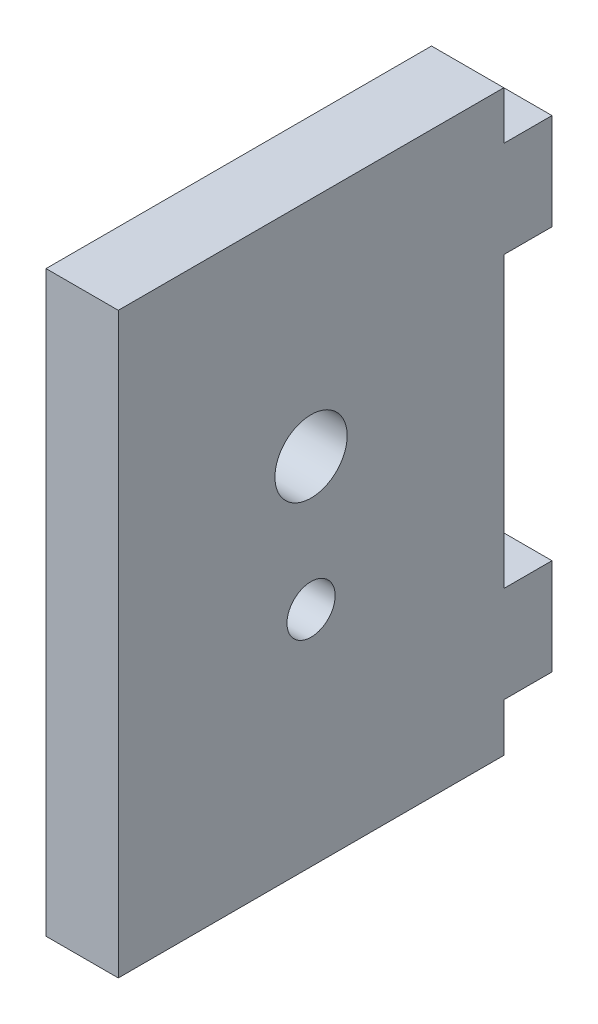
ISO-10303-21;
HEADER;
FILE_DESCRIPTION(('STEP AP214'),'2;1');
FILE_NAME('part.step','',(''),(''),'','','');
FILE_SCHEMA(('AUTOMOTIVE_DESIGN { 1 0 10303 214 1 1 1 1 }'));
ENDSEC;
DATA;
#1=APPLICATION_CONTEXT('core data for automotive mechanical design processes');
#2=APPLICATION_PROTOCOL_DEFINITION('international standard','automotive_design',2000,#1);
#3=PRODUCT_CONTEXT('',#1,'mechanical');
#4=PRODUCT('Part','Part','',(#3));
#5=PRODUCT_RELATED_PRODUCT_CATEGORY('part','',(#4));
#6=PRODUCT_DEFINITION_FORMATION('','',#4);
#7=PRODUCT_DEFINITION_CONTEXT('part definition',#1,'design');
#8=PRODUCT_DEFINITION('design','',#6,#7);
#9=PRODUCT_DEFINITION_SHAPE('','',#8);
#10=(LENGTH_UNIT() NAMED_UNIT(*) SI_UNIT(.MILLI.,.METRE.));
#11=(NAMED_UNIT(*) PLANE_ANGLE_UNIT() SI_UNIT($,.RADIAN.));
#12=(NAMED_UNIT(*) SI_UNIT($,.STERADIAN.) SOLID_ANGLE_UNIT());
#13=UNCERTAINTY_MEASURE_WITH_UNIT(LENGTH_MEASURE(1.E-05),#10,'distance_accuracy_value','');
#14=(GEOMETRIC_REPRESENTATION_CONTEXT(3) GLOBAL_UNCERTAINTY_ASSIGNED_CONTEXT((#13)) GLOBAL_UNIT_ASSIGNED_CONTEXT((#10,
#11,#12)) REPRESENTATION_CONTEXT('',''));
#15=CARTESIAN_POINT('',(0.,0.,0.));
#16=DIRECTION('',(0.,0.,1.));
#17=DIRECTION('',(1.,0.,0.));
#18=AXIS2_PLACEMENT_3D('',#15,#16,#17);
#19=CARTESIAN_POINT('',(9.525,0.,0.));
#20=DIRECTION('',(0.,0.,1.));
#21=DIRECTION('',(1.,0.,0.));
#22=AXIS2_PLACEMENT_3D('',#19,#20,#21);
#23=PLANE('',#22);
#24=DIRECTION('',(1.,0.,0.));
#25=VECTOR('',#24,1.);
#26=CARTESIAN_POINT('',(9.525,19.05,0.));
#27=LINE('',#26,#25);
#28=CARTESIAN_POINT('',(0.,19.05,0.));
#29=VERTEX_POINT('',#28);
#30=CARTESIAN_POINT('',(9.525,19.05,0.));
#31=VERTEX_POINT('',#30);
#32=EDGE_CURVE('E344',#29,#31,#27,.T.);
#33=ORIENTED_EDGE('',*,*,#32,.F.);
#34=DIRECTION('',(0.,1.,0.));
#35=VECTOR('',#34,1.);
#36=CARTESIAN_POINT('',(0.,0.,0.));
#37=LINE('',#36,#35);
#38=CARTESIAN_POINT('',(0.,57.15,0.));
#39=VERTEX_POINT('',#38);
#40=EDGE_CURVE('E429',#29,#39,#37,.T.);
#41=ORIENTED_EDGE('',*,*,#40,.T.);
#42=DIRECTION('',(-1.,0.,0.));
#43=VECTOR('',#42,1.);
#44=CARTESIAN_POINT('',(9.525,57.15,0.));
#45=LINE('',#44,#43);
#46=CARTESIAN_POINT('',(9.525,57.15,0.));
#47=VERTEX_POINT('',#46);
#48=EDGE_CURVE('E255',#47,#39,#45,.T.);
#49=ORIENTED_EDGE('',*,*,#48,.F.);
#50=DIRECTION('',(0.,1.,0.));
#51=VECTOR('',#50,1.);
#52=CARTESIAN_POINT('',(9.525,0.,0.));
#53=LINE('',#52,#51);
#54=EDGE_CURVE('E413',#31,#47,#53,.T.);
#55=ORIENTED_EDGE('',*,*,#54,.F.);
#56=EDGE_LOOP('',(#33,#41,#49,#55));
#57=FACE_BOUND('',#56,.T.);
#58=ADVANCED_FACE('F227',(#57),#23,.F.);
#59=DIRECTION('',(-1.,0.,0.));
#60=VECTOR('',#59,1.);
#61=CARTESIAN_POINT('',(9.525,6.35,0.));
#62=LINE('',#61,#60);
#63=CARTESIAN_POINT('',(9.525,6.35,0.));
#64=VERTEX_POINT('',#63);
#65=CARTESIAN_POINT('',(0.,6.35,0.));
#66=VERTEX_POINT('',#65);
#67=EDGE_CURVE('E383',#64,#66,#62,.T.);
#68=ORIENTED_EDGE('',*,*,#67,.F.);
#69=CARTESIAN_POINT('',(9.525,0.,0.));
#70=VERTEX_POINT('',#69);
#71=EDGE_CURVE('E350',#70,#64,#53,.T.);
#72=ORIENTED_EDGE('',*,*,#71,.F.);
#73=DIRECTION('',(-1.,0.,0.));
#74=VECTOR('',#73,1.);
#75=CARTESIAN_POINT('',(9.525,0.,0.));
#76=LINE('',#75,#74);
#77=CARTESIAN_POINT('',(0.,0.,0.));
#78=VERTEX_POINT('',#77);
#79=EDGE_CURVE('E12',#70,#78,#76,.T.);
#80=ORIENTED_EDGE('',*,*,#79,.T.);
#81=EDGE_CURVE('E426',#78,#66,#37,.T.);
#82=ORIENTED_EDGE('',*,*,#81,.T.);
#83=EDGE_LOOP('',(#68,#72,#80,#82));
#84=FACE_BOUND('',#83,.T.);
#85=ADVANCED_FACE('F504',(#84),#23,.F.);
#86=DIRECTION('',(1.,0.,0.));
#87=VECTOR('',#86,1.);
#88=CARTESIAN_POINT('',(9.525,69.85,0.));
#89=LINE('',#88,#87);
#90=CARTESIAN_POINT('',(0.,69.85,0.));
#91=VERTEX_POINT('',#90);
#92=CARTESIAN_POINT('',(9.525,69.85,0.));
#93=VERTEX_POINT('',#92);
#94=EDGE_CURVE('E378',#91,#93,#89,.T.);
#95=ORIENTED_EDGE('',*,*,#94,.F.);
#96=CARTESIAN_POINT('',(0.,76.2,0.));
#97=VERTEX_POINT('',#96);
#98=EDGE_CURVE('E422',#91,#97,#37,.T.);
#99=ORIENTED_EDGE('',*,*,#98,.T.);
#100=DIRECTION('',(-1.,0.,0.));
#101=VECTOR('',#100,1.);
#102=CARTESIAN_POINT('',(9.525,76.2,0.));
#103=LINE('',#102,#101);
#104=CARTESIAN_POINT('',(9.525,76.2,0.));
#105=VERTEX_POINT('',#104);
#106=EDGE_CURVE('E239',#105,#97,#103,.T.);
#107=ORIENTED_EDGE('',*,*,#106,.F.);
#108=EDGE_CURVE('E247',#93,#105,#53,.T.);
#109=ORIENTED_EDGE('',*,*,#108,.F.);
#110=EDGE_LOOP('',(#95,#99,#107,#109));
#111=FACE_BOUND('',#110,.T.);
#112=ADVANCED_FACE('F477',(#111),#23,.F.);
#113=CARTESIAN_POINT('',(9.525,0.,0.));
#114=DIRECTION('',(0.,1.,0.));
#115=DIRECTION('',(0.,0.,1.));
#116=AXIS2_PLACEMENT_3D('',#113,#114,#115);
#117=PLANE('',#116);
#118=DIRECTION('',(0.,0.,-1.));
#119=VECTOR('',#118,1.);
#120=CARTESIAN_POINT('',(0.,0.,0.));
#121=LINE('',#120,#119);
#122=CARTESIAN_POINT('',(0.,0.,50.8));
#123=VERTEX_POINT('',#122);
#124=EDGE_CURVE('E398',#123,#78,#121,.T.);
#125=ORIENTED_EDGE('',*,*,#124,.T.);
#126=ORIENTED_EDGE('',*,*,#79,.F.);
#127=DIRECTION('',(0.,0.,-1.));
#128=VECTOR('',#127,1.);
#129=CARTESIAN_POINT('',(9.525,0.,0.));
#130=LINE('',#129,#128);
#131=CARTESIAN_POINT('',(9.525,0.,50.8));
#132=VERTEX_POINT('',#131);
#133=EDGE_CURVE('E406',#132,#70,#130,.T.);
#134=ORIENTED_EDGE('',*,*,#133,.F.);
#135=DIRECTION('',(-1.,0.,0.));
#136=VECTOR('',#135,1.);
#137=CARTESIAN_POINT('',(9.525,0.,50.8));
#138=LINE('',#137,#136);
#139=EDGE_CURVE('E423',#132,#123,#138,.T.);
#140=ORIENTED_EDGE('',*,*,#139,.T.);
#141=EDGE_LOOP('',(#125,#126,#134,#140));
#142=FACE_BOUND('',#141,.T.);
#143=ADVANCED_FACE('F234',(#142),#117,.F.);
#144=CARTESIAN_POINT('',(9.525,76.2,0.));
#145=DIRECTION('',(0.,-1.,0.));
#146=DIRECTION('',(0.,0.,-1.));
#147=AXIS2_PLACEMENT_3D('',#144,#145,#146);
#148=PLANE('',#147);
#149=DIRECTION('',(0.,0.,1.));
#150=VECTOR('',#149,1.);
#151=CARTESIAN_POINT('',(0.,76.2,0.));
#152=LINE('',#151,#150);
#153=CARTESIAN_POINT('',(0.,76.2,50.8));
#154=VERTEX_POINT('',#153);
#155=EDGE_CURVE('E427',#97,#154,#152,.T.);
#156=ORIENTED_EDGE('',*,*,#155,.T.);
#157=DIRECTION('',(-1.,0.,0.));
#158=VECTOR('',#157,1.);
#159=CARTESIAN_POINT('',(9.525,76.2,50.8));
#160=LINE('',#159,#158);
#161=CARTESIAN_POINT('',(9.525,76.2,50.8));
#162=VERTEX_POINT('',#161);
#163=EDGE_CURVE('E437',#162,#154,#160,.T.);
#164=ORIENTED_EDGE('',*,*,#163,.F.);
#165=DIRECTION('',(0.,0.,1.));
#166=VECTOR('',#165,1.);
#167=CARTESIAN_POINT('',(9.525,76.2,0.));
#168=LINE('',#167,#166);
#169=EDGE_CURVE('E411',#105,#162,#168,.T.);
#170=ORIENTED_EDGE('',*,*,#169,.F.);
#171=ORIENTED_EDGE('',*,*,#106,.T.);
#172=EDGE_LOOP('',(#156,#164,#170,#171));
#173=FACE_BOUND('',#172,.T.);
#174=ADVANCED_FACE('F450',(#173),#148,.F.);
#175=CARTESIAN_POINT('',(9.525,0.,50.8));
#176=DIRECTION('',(0.,0.,-1.));
#177=DIRECTION('',(-1.,0.,0.));
#178=AXIS2_PLACEMENT_3D('',#175,#176,#177);
#179=PLANE('',#178);
#180=DIRECTION('',(0.,-1.,0.));
#181=VECTOR('',#180,1.);
#182=CARTESIAN_POINT('',(0.,0.,50.8));
#183=LINE('',#182,#181);
#184=EDGE_CURVE('E412',#154,#123,#183,.T.);
#185=ORIENTED_EDGE('',*,*,#184,.T.);
#186=ORIENTED_EDGE('',*,*,#139,.F.);
#187=DIRECTION('',(0.,-1.,0.));
#188=VECTOR('',#187,1.);
#189=CARTESIAN_POINT('',(9.525,0.,50.8));
#190=LINE('',#189,#188);
#191=EDGE_CURVE('E416',#162,#132,#190,.T.);
#192=ORIENTED_EDGE('',*,*,#191,.F.);
#193=ORIENTED_EDGE('',*,*,#163,.T.);
#194=EDGE_LOOP('',(#185,#186,#192,#193));
#195=FACE_BOUND('',#194,.T.);
#196=ADVANCED_FACE('F460',(#195),#179,.F.);
#197=CARTESIAN_POINT('',(9.525,0.,0.));
#198=DIRECTION('',(-1.,0.,0.));
#199=DIRECTION('',(0.,0.,1.));
#200=AXIS2_PLACEMENT_3D('',#197,#198,#199);
#201=PLANE('',#200);
#202=CARTESIAN_POINT('',(9.525,29.36875,25.4));
#203=DIRECTION('',(1.,0.,0.));
#204=DIRECTION('',(0.,0.,-1.));
#205=AXIS2_PLACEMENT_3D('',#202,#203,#204);
#206=CIRCLE('',#205,3.175);
#207=CARTESIAN_POINT('',(9.525,29.36875,22.225));
#208=VERTEX_POINT('',#207);
#209=EDGE_CURVE('E402',#208,#208,#206,.T.);
#210=ORIENTED_EDGE('',*,*,#209,.F.);
#211=EDGE_LOOP('',(#210));
#212=FACE_BOUND('',#211,.T.);
#213=CARTESIAN_POINT('',(9.525,46.83125,25.4));
#214=DIRECTION('',(1.,0.,0.));
#215=DIRECTION('',(0.,0.,-1.));
#216=AXIS2_PLACEMENT_3D('',#213,#214,#215);
#217=CIRCLE('',#216,4.7625);
#218=CARTESIAN_POINT('',(9.525,46.83125,20.6375));
#219=VERTEX_POINT('',#218);
#220=EDGE_CURVE('E352',#219,#219,#217,.T.);
#221=ORIENTED_EDGE('',*,*,#220,.F.);
#222=EDGE_LOOP('',(#221));
#223=FACE_BOUND('',#222,.T.);
#224=ORIENTED_EDGE('',*,*,#133,.T.);
#225=ORIENTED_EDGE('',*,*,#71,.T.);
#226=DIRECTION('',(0.,0.,1.));
#227=VECTOR('',#226,1.);
#228=CARTESIAN_POINT('',(9.525,6.35,-6.35));
#229=LINE('',#228,#227);
#230=CARTESIAN_POINT('',(9.525,6.35,-6.35));
#231=VERTEX_POINT('',#230);
#232=EDGE_CURVE('E324',#231,#64,#229,.T.);
#233=ORIENTED_EDGE('',*,*,#232,.F.);
#234=DIRECTION('',(0.,-1.,0.));
#235=VECTOR('',#234,1.);
#236=CARTESIAN_POINT('',(9.525,6.35,-6.35));
#237=LINE('',#236,#235);
#238=CARTESIAN_POINT('',(9.525,19.05,-6.35));
#239=VERTEX_POINT('',#238);
#240=EDGE_CURVE('E335',#239,#231,#237,.T.);
#241=ORIENTED_EDGE('',*,*,#240,.F.);
#242=DIRECTION('',(0.,0.,1.));
#243=VECTOR('',#242,1.);
#244=CARTESIAN_POINT('',(9.525,19.05,-6.35));
#245=LINE('',#244,#243);
#246=EDGE_CURVE('E466',#239,#31,#245,.T.);
#247=ORIENTED_EDGE('',*,*,#246,.T.);
#248=ORIENTED_EDGE('',*,*,#54,.T.);
#249=DIRECTION('',(0.,0.,1.));
#250=VECTOR('',#249,1.);
#251=CARTESIAN_POINT('',(9.525,57.15,-6.35));
#252=LINE('',#251,#250);
#253=CARTESIAN_POINT('',(9.525,57.15,-6.35));
#254=VERTEX_POINT('',#253);
#255=EDGE_CURVE('E363',#254,#47,#252,.T.);
#256=ORIENTED_EDGE('',*,*,#255,.F.);
#257=DIRECTION('',(0.,-1.,0.));
#258=VECTOR('',#257,1.);
#259=CARTESIAN_POINT('',(9.525,57.15,-6.35));
#260=LINE('',#259,#258);
#261=CARTESIAN_POINT('',(9.525,69.85,-6.35));
#262=VERTEX_POINT('',#261);
#263=EDGE_CURVE('E381',#262,#254,#260,.T.);
#264=ORIENTED_EDGE('',*,*,#263,.F.);
#265=DIRECTION('',(0.,0.,1.));
#266=VECTOR('',#265,1.);
#267=CARTESIAN_POINT('',(9.525,69.85,-6.35));
#268=LINE('',#267,#266);
#269=EDGE_CURVE('E373',#262,#93,#268,.T.);
#270=ORIENTED_EDGE('',*,*,#269,.T.);
#271=ORIENTED_EDGE('',*,*,#108,.T.);
#272=ORIENTED_EDGE('',*,*,#169,.T.);
#273=ORIENTED_EDGE('',*,*,#191,.T.);
#274=EDGE_LOOP('',(#224,#225,#233,#241,#247,#248,#256,#264,#270,#271,#272,#273));
#275=FACE_BOUND('',#274,.T.);
#276=ADVANCED_FACE('F347',(#212,#223,#275),#201,.F.);
#277=CARTESIAN_POINT('',(0.,0.,0.));
#278=DIRECTION('',(-1.,0.,0.));
#279=DIRECTION('',(0.,0.,1.));
#280=AXIS2_PLACEMENT_3D('',#277,#278,#279);
#281=PLANE('',#280);
#282=CARTESIAN_POINT('',(0.,29.36875,25.4));
#283=DIRECTION('',(1.,0.,0.));
#284=DIRECTION('',(0.,0.,-1.));
#285=AXIS2_PLACEMENT_3D('',#282,#283,#284);
#286=CIRCLE('',#285,3.175);
#287=CARTESIAN_POINT('',(0.,29.36875,22.225));
#288=VERTEX_POINT('',#287);
#289=EDGE_CURVE('E397',#288,#288,#286,.T.);
#290=ORIENTED_EDGE('',*,*,#289,.T.);
#291=EDGE_LOOP('',(#290));
#292=FACE_BOUND('',#291,.T.);
#293=CARTESIAN_POINT('',(0.,46.83125,25.4));
#294=DIRECTION('',(1.,0.,0.));
#295=DIRECTION('',(0.,0.,-1.));
#296=AXIS2_PLACEMENT_3D('',#293,#294,#295);
#297=CIRCLE('',#296,4.7625);
#298=CARTESIAN_POINT('',(0.,46.83125,20.6375));
#299=VERTEX_POINT('',#298);
#300=EDGE_CURVE('E349',#299,#299,#297,.T.);
#301=ORIENTED_EDGE('',*,*,#300,.T.);
#302=EDGE_LOOP('',(#301));
#303=FACE_BOUND('',#302,.T.);
#304=ORIENTED_EDGE('',*,*,#124,.F.);
#305=ORIENTED_EDGE('',*,*,#184,.F.);
#306=ORIENTED_EDGE('',*,*,#155,.F.);
#307=ORIENTED_EDGE('',*,*,#98,.F.);
#308=DIRECTION('',(0.,0.,1.));
#309=VECTOR('',#308,1.);
#310=CARTESIAN_POINT('',(0.,69.85,-6.35));
#311=LINE('',#310,#309);
#312=CARTESIAN_POINT('',(0.,69.85,-6.35));
#313=VERTEX_POINT('',#312);
#314=EDGE_CURVE('E369',#313,#91,#311,.T.);
#315=ORIENTED_EDGE('',*,*,#314,.F.);
#316=DIRECTION('',(0.,1.,0.));
#317=VECTOR('',#316,1.);
#318=CARTESIAN_POINT('',(0.,57.15,-6.35));
#319=LINE('',#318,#317);
#320=CARTESIAN_POINT('',(0.,57.15,-6.35));
#321=VERTEX_POINT('',#320);
#322=EDGE_CURVE('E390',#321,#313,#319,.T.);
#323=ORIENTED_EDGE('',*,*,#322,.F.);
#324=DIRECTION('',(0.,0.,1.));
#325=VECTOR('',#324,1.);
#326=CARTESIAN_POINT('',(0.,57.15,-6.35));
#327=LINE('',#326,#325);
#328=EDGE_CURVE('E364',#321,#39,#327,.T.);
#329=ORIENTED_EDGE('',*,*,#328,.T.);
#330=ORIENTED_EDGE('',*,*,#40,.F.);
#331=DIRECTION('',(0.,0.,1.));
#332=VECTOR('',#331,1.);
#333=CARTESIAN_POINT('',(0.,19.05,-6.35));
#334=LINE('',#333,#332);
#335=CARTESIAN_POINT('',(0.,19.05,-6.35));
#336=VERTEX_POINT('',#335);
#337=EDGE_CURVE('E359',#336,#29,#334,.T.);
#338=ORIENTED_EDGE('',*,*,#337,.F.);
#339=DIRECTION('',(0.,1.,0.));
#340=VECTOR('',#339,1.);
#341=CARTESIAN_POINT('',(0.,6.35,-6.35));
#342=LINE('',#341,#340);
#343=CARTESIAN_POINT('',(0.,6.35,-6.35));
#344=VERTEX_POINT('',#343);
#345=EDGE_CURVE('E332',#344,#336,#342,.T.);
#346=ORIENTED_EDGE('',*,*,#345,.F.);
#347=DIRECTION('',(0.,0.,1.));
#348=VECTOR('',#347,1.);
#349=CARTESIAN_POINT('',(0.,6.35,-6.35));
#350=LINE('',#349,#348);
#351=EDGE_CURVE('E330',#344,#66,#350,.T.);
#352=ORIENTED_EDGE('',*,*,#351,.T.);
#353=ORIENTED_EDGE('',*,*,#81,.F.);
#354=EDGE_LOOP('',(#304,#305,#306,#307,#315,#323,#329,#330,#338,#346,#352,#353));
#355=FACE_BOUND('',#354,.T.);
#356=ADVANCED_FACE('F455',(#292,#303,#355),#281,.T.);
#357=CARTESIAN_POINT('',(0.,46.83125,25.4));
#358=DIRECTION('',(1.,0.,0.));
#359=DIRECTION('',(0.,0.,-1.));
#360=AXIS2_PLACEMENT_3D('',#357,#358,#359);
#361=CYLINDRICAL_SURFACE('',#360,4.7625);
#362=CARTESIAN_POINT('',(0.,46.83125,20.6375));
#363=CARTESIAN_POINT('',(0.0992187499999999,46.83125,20.6375));
#364=CARTESIAN_POINT('',(0.1984375,46.83125,20.6375));
#365=CARTESIAN_POINT('',(0.396875,46.83125,20.6375));
#366=CARTESIAN_POINT('',(0.49609375,46.83125,20.6375));
#367=CARTESIAN_POINT('',(0.69453125,46.83125,20.6375));
#368=CARTESIAN_POINT('',(0.79375,46.83125,20.6375));
#369=CARTESIAN_POINT('',(0.9921875,46.83125,20.6375));
#370=CARTESIAN_POINT('',(1.09140625,46.83125,20.6375));
#371=CARTESIAN_POINT('',(1.28984375,46.83125,20.6375));
#372=CARTESIAN_POINT('',(1.3890625,46.83125,20.6375));
#373=CARTESIAN_POINT('',(1.5875,46.83125,20.6375));
#374=CARTESIAN_POINT('',(1.68671875,46.83125,20.6375));
#375=CARTESIAN_POINT('',(1.88515625,46.83125,20.6375));
#376=CARTESIAN_POINT('',(1.984375,46.83125,20.6375));
#377=CARTESIAN_POINT('',(2.1828125,46.83125,20.6375));
#378=CARTESIAN_POINT('',(2.28203125,46.83125,20.6375));
#379=CARTESIAN_POINT('',(2.48046875,46.83125,20.6375));
#380=CARTESIAN_POINT('',(2.5796875,46.83125,20.6375));
#381=CARTESIAN_POINT('',(2.778125,46.83125,20.6375));
#382=CARTESIAN_POINT('',(2.87734375,46.83125,20.6375));
#383=CARTESIAN_POINT('',(3.07578125,46.83125,20.6375));
#384=CARTESIAN_POINT('',(3.175,46.83125,20.6375));
#385=CARTESIAN_POINT('',(3.3734375,46.83125,20.6375));
#386=CARTESIAN_POINT('',(3.47265625,46.83125,20.6375));
#387=CARTESIAN_POINT('',(3.67109375,46.83125,20.6375));
#388=CARTESIAN_POINT('',(3.7703125,46.83125,20.6375));
#389=CARTESIAN_POINT('',(3.96875,46.83125,20.6375));
#390=CARTESIAN_POINT('',(4.06796875,46.83125,20.6375));
#391=CARTESIAN_POINT('',(4.26640625,46.83125,20.6375));
#392=CARTESIAN_POINT('',(4.365625,46.83125,20.6375));
#393=CARTESIAN_POINT('',(4.5640625,46.83125,20.6375));
#394=CARTESIAN_POINT('',(4.66328125,46.83125,20.6375));
#395=CARTESIAN_POINT('',(4.86171875,46.83125,20.6375));
#396=CARTESIAN_POINT('',(4.9609375,46.83125,20.6375));
#397=CARTESIAN_POINT('',(5.159375,46.83125,20.6375));
#398=CARTESIAN_POINT('',(5.25859375,46.83125,20.6375));
#399=CARTESIAN_POINT('',(5.45703125,46.83125,20.6375));
#400=CARTESIAN_POINT('',(5.55625,46.83125,20.6375));
#401=CARTESIAN_POINT('',(5.7546875,46.83125,20.6375));
#402=CARTESIAN_POINT('',(5.85390625,46.83125,20.6375));
#403=CARTESIAN_POINT('',(6.05234375,46.83125,20.6375));
#404=CARTESIAN_POINT('',(6.1515625,46.83125,20.6375));
#405=CARTESIAN_POINT('',(6.35,46.83125,20.6375));
#406=CARTESIAN_POINT('',(6.44921875,46.83125,20.6375));
#407=CARTESIAN_POINT('',(6.64765625,46.83125,20.6375));
#408=CARTESIAN_POINT('',(6.746875,46.83125,20.6375));
#409=CARTESIAN_POINT('',(6.9453125,46.83125,20.6375));
#410=CARTESIAN_POINT('',(7.04453125,46.83125,20.6375));
#411=CARTESIAN_POINT('',(7.24296875,46.83125,20.6375));
#412=CARTESIAN_POINT('',(7.3421875,46.83125,20.6375));
#413=CARTESIAN_POINT('',(7.540625,46.83125,20.6375));
#414=CARTESIAN_POINT('',(7.63984375,46.83125,20.6375));
#415=CARTESIAN_POINT('',(7.83828125,46.83125,20.6375));
#416=CARTESIAN_POINT('',(7.9375,46.83125,20.6375));
#417=CARTESIAN_POINT('',(8.1359375,46.83125,20.6375));
#418=CARTESIAN_POINT('',(8.23515625,46.83125,20.6375));
#419=CARTESIAN_POINT('',(8.43359375,46.83125,20.6375));
#420=CARTESIAN_POINT('',(8.5328125,46.83125,20.6375));
#421=CARTESIAN_POINT('',(8.73125,46.83125,20.6375));
#422=CARTESIAN_POINT('',(8.83046875,46.83125,20.6375));
#423=CARTESIAN_POINT('',(9.02890625,46.83125,20.6375));
#424=CARTESIAN_POINT('',(9.128125,46.83125,20.6375));
#425=CARTESIAN_POINT('',(9.3265625,46.83125,20.6375));
#426=CARTESIAN_POINT('',(9.42578125,46.83125,20.6375));
#427=CARTESIAN_POINT('',(9.525,46.83125,20.6375));
#428=B_SPLINE_CURVE_WITH_KNOTS('',3,(#362,#363,#364,#365,#366,#367,#368,#369,#370,#371,#372,
#373,#374,#375,#376,#377,#378,#379,#380,#381,#382,#383,#384,#385,#386,#387,#388,#389,#390,#391,
#392,#393,#394,#395,#396,#397,#398,#399,#400,#401,#402,#403,#404,#405,#406,#407,#408,#409,#410,
#411,#412,#413,#414,#415,#416,#417,#418,#419,#420,#421,#422,#423,#424,#425,#426,#427),
.UNSPECIFIED.,.F.,.F.,(4,2,2,2,2,2,2,2,2,2,2,2,2,2,2,2,2,2,2,2,2,2,2,2,2,2,2,2,2,2,2,2,4),(0.,
0.29765625,0.5953125,0.89296875,1.190625,1.48828125,1.7859375,2.08359375,2.38125,2.67890625,
2.9765625,3.27421875,3.571875,3.86953125,4.1671875,4.46484375,4.7625,5.06015625,5.3578125,
5.65546875,5.953125,6.25078125,6.5484375,6.84609375,7.14375,7.44140625,7.7390625,8.03671875,
8.334375,8.63203125,8.9296875,9.22734375,9.525),.UNSPECIFIED.);
#429=EDGE_CURVE('BSEAM520',#299,#219,#428,.T.);
#430=ORIENTED_EDGE('',*,*,#300,.F.);
#431=ORIENTED_EDGE('',*,*,#220,.T.);
#432=ORIENTED_EDGE('',*,*,#429,.T.);
#433=ORIENTED_EDGE('',*,*,#429,.F.);
#434=EDGE_LOOP('',(#430,#432,#431,#433));
#435=FACE_BOUND('',#434,.T.);
#436=ADVANCED_FACE('F520',(#435),#361,.F.);
#437=CARTESIAN_POINT('',(0.,29.36875,25.4));
#438=DIRECTION('',(1.,0.,0.));
#439=DIRECTION('',(0.,0.,-1.));
#440=AXIS2_PLACEMENT_3D('',#437,#438,#439);
#441=CYLINDRICAL_SURFACE('',#440,3.175);
#442=CARTESIAN_POINT('',(0.,29.36875,22.225));
#443=CARTESIAN_POINT('',(0.0992187499999999,29.36875,22.225));
#444=CARTESIAN_POINT('',(0.1984375,29.36875,22.225));
#445=CARTESIAN_POINT('',(0.396875,29.36875,22.225));
#446=CARTESIAN_POINT('',(0.49609375,29.36875,22.225));
#447=CARTESIAN_POINT('',(0.69453125,29.36875,22.225));
#448=CARTESIAN_POINT('',(0.79375,29.36875,22.225));
#449=CARTESIAN_POINT('',(0.9921875,29.36875,22.225));
#450=CARTESIAN_POINT('',(1.09140625,29.36875,22.225));
#451=CARTESIAN_POINT('',(1.28984375,29.36875,22.225));
#452=CARTESIAN_POINT('',(1.3890625,29.36875,22.225));
#453=CARTESIAN_POINT('',(1.5875,29.36875,22.225));
#454=CARTESIAN_POINT('',(1.68671875,29.36875,22.225));
#455=CARTESIAN_POINT('',(1.88515625,29.36875,22.225));
#456=CARTESIAN_POINT('',(1.984375,29.36875,22.225));
#457=CARTESIAN_POINT('',(2.1828125,29.36875,22.225));
#458=CARTESIAN_POINT('',(2.28203125,29.36875,22.225));
#459=CARTESIAN_POINT('',(2.48046875,29.36875,22.225));
#460=CARTESIAN_POINT('',(2.5796875,29.36875,22.225));
#461=CARTESIAN_POINT('',(2.778125,29.36875,22.225));
#462=CARTESIAN_POINT('',(2.87734375,29.36875,22.225));
#463=CARTESIAN_POINT('',(3.07578125,29.36875,22.225));
#464=CARTESIAN_POINT('',(3.175,29.36875,22.225));
#465=CARTESIAN_POINT('',(3.3734375,29.36875,22.225));
#466=CARTESIAN_POINT('',(3.47265625,29.36875,22.225));
#467=CARTESIAN_POINT('',(3.67109375,29.36875,22.225));
#468=CARTESIAN_POINT('',(3.7703125,29.36875,22.225));
#469=CARTESIAN_POINT('',(3.96875,29.36875,22.225));
#470=CARTESIAN_POINT('',(4.06796875,29.36875,22.225));
#471=CARTESIAN_POINT('',(4.26640625,29.36875,22.225));
#472=CARTESIAN_POINT('',(4.365625,29.36875,22.225));
#473=CARTESIAN_POINT('',(4.5640625,29.36875,22.225));
#474=CARTESIAN_POINT('',(4.66328125,29.36875,22.225));
#475=CARTESIAN_POINT('',(4.86171875,29.36875,22.225));
#476=CARTESIAN_POINT('',(4.9609375,29.36875,22.225));
#477=CARTESIAN_POINT('',(5.159375,29.36875,22.225));
#478=CARTESIAN_POINT('',(5.25859375,29.36875,22.225));
#479=CARTESIAN_POINT('',(5.45703125,29.36875,22.225));
#480=CARTESIAN_POINT('',(5.55625,29.36875,22.225));
#481=CARTESIAN_POINT('',(5.7546875,29.36875,22.225));
#482=CARTESIAN_POINT('',(5.85390625,29.36875,22.225));
#483=CARTESIAN_POINT('',(6.05234375,29.36875,22.225));
#484=CARTESIAN_POINT('',(6.1515625,29.36875,22.225));
#485=CARTESIAN_POINT('',(6.35,29.36875,22.225));
#486=CARTESIAN_POINT('',(6.44921875,29.36875,22.225));
#487=CARTESIAN_POINT('',(6.64765625,29.36875,22.225));
#488=CARTESIAN_POINT('',(6.746875,29.36875,22.225));
#489=CARTESIAN_POINT('',(6.9453125,29.36875,22.225));
#490=CARTESIAN_POINT('',(7.04453125,29.36875,22.225));
#491=CARTESIAN_POINT('',(7.24296875,29.36875,22.225));
#492=CARTESIAN_POINT('',(7.3421875,29.36875,22.225));
#493=CARTESIAN_POINT('',(7.540625,29.36875,22.225));
#494=CARTESIAN_POINT('',(7.63984375,29.36875,22.225));
#495=CARTESIAN_POINT('',(7.83828125,29.36875,22.225));
#496=CARTESIAN_POINT('',(7.9375,29.36875,22.225));
#497=CARTESIAN_POINT('',(8.1359375,29.36875,22.225));
#498=CARTESIAN_POINT('',(8.23515625,29.36875,22.225));
#499=CARTESIAN_POINT('',(8.43359375,29.36875,22.225));
#500=CARTESIAN_POINT('',(8.5328125,29.36875,22.225));
#501=CARTESIAN_POINT('',(8.73125,29.36875,22.225));
#502=CARTESIAN_POINT('',(8.83046875,29.36875,22.225));
#503=CARTESIAN_POINT('',(9.02890625,29.36875,22.225));
#504=CARTESIAN_POINT('',(9.128125,29.36875,22.225));
#505=CARTESIAN_POINT('',(9.3265625,29.36875,22.225));
#506=CARTESIAN_POINT('',(9.42578125,29.36875,22.225));
#507=CARTESIAN_POINT('',(9.525,29.36875,22.225));
#508=B_SPLINE_CURVE_WITH_KNOTS('',3,(#442,#443,#444,#445,#446,#447,#448,#449,#450,#451,#452,
#453,#454,#455,#456,#457,#458,#459,#460,#461,#462,#463,#464,#465,#466,#467,#468,#469,#470,#471,
#472,#473,#474,#475,#476,#477,#478,#479,#480,#481,#482,#483,#484,#485,#486,#487,#488,#489,#490,
#491,#492,#493,#494,#495,#496,#497,#498,#499,#500,#501,#502,#503,#504,#505,#506,#507),
.UNSPECIFIED.,.F.,.F.,(4,2,2,2,2,2,2,2,2,2,2,2,2,2,2,2,2,2,2,2,2,2,2,2,2,2,2,2,2,2,2,2,4),(0.,
0.29765625,0.5953125,0.89296875,1.190625,1.48828125,1.7859375,2.08359375,2.38125,2.67890625,
2.9765625,3.27421875,3.571875,3.86953125,4.1671875,4.46484375,4.7625,5.06015625,5.3578125,
5.65546875,5.953125,6.25078125,6.5484375,6.84609375,7.14375,7.44140625,7.7390625,8.03671875,
8.334375,8.63203125,8.9296875,9.22734375,9.525),.UNSPECIFIED.);
#509=EDGE_CURVE('BSEAM521',#288,#208,#508,.T.);
#510=ORIENTED_EDGE('',*,*,#289,.F.);
#511=ORIENTED_EDGE('',*,*,#209,.T.);
#512=ORIENTED_EDGE('',*,*,#509,.T.);
#513=ORIENTED_EDGE('',*,*,#509,.F.);
#514=EDGE_LOOP('',(#510,#512,#511,#513));
#515=FACE_BOUND('',#514,.T.);
#516=ADVANCED_FACE('F521',(#515),#441,.F.);
#517=CARTESIAN_POINT('',(9.525,57.15,-6.35));
#518=DIRECTION('',(0.,1.,0.));
#519=DIRECTION('',(0.,0.,1.));
#520=AXIS2_PLACEMENT_3D('',#517,#518,#519);
#521=PLANE('',#520);
#522=ORIENTED_EDGE('',*,*,#48,.T.);
#523=ORIENTED_EDGE('',*,*,#328,.F.);
#524=DIRECTION('',(-1.,0.,0.));
#525=VECTOR('',#524,1.);
#526=CARTESIAN_POINT('',(9.525,57.15,-6.35));
#527=LINE('',#526,#525);
#528=EDGE_CURVE('E388',#254,#321,#527,.T.);
#529=ORIENTED_EDGE('',*,*,#528,.F.);
#530=ORIENTED_EDGE('',*,*,#255,.T.);
#531=EDGE_LOOP('',(#522,#523,#529,#530));
#532=FACE_BOUND('',#531,.T.);
#533=ADVANCED_FACE('F472',(#532),#521,.F.);
#534=CARTESIAN_POINT('',(9.525,69.85,-6.35));
#535=DIRECTION('',(0.,-1.,0.));
#536=DIRECTION('',(0.,0.,-1.));
#537=AXIS2_PLACEMENT_3D('',#534,#535,#536);
#538=PLANE('',#537);
#539=ORIENTED_EDGE('',*,*,#94,.T.);
#540=ORIENTED_EDGE('',*,*,#269,.F.);
#541=DIRECTION('',(1.,0.,0.));
#542=VECTOR('',#541,1.);
#543=CARTESIAN_POINT('',(9.525,69.85,-6.35));
#544=LINE('',#543,#542);
#545=EDGE_CURVE('E380',#313,#262,#544,.T.);
#546=ORIENTED_EDGE('',*,*,#545,.F.);
#547=ORIENTED_EDGE('',*,*,#314,.T.);
#548=EDGE_LOOP('',(#539,#540,#546,#547));
#549=FACE_BOUND('',#548,.T.);
#550=ADVANCED_FACE('F479',(#549),#538,.F.);
#551=CARTESIAN_POINT('',(0.,0.,-6.35));
#552=DIRECTION('',(0.,0.,1.));
#553=DIRECTION('',(1.,0.,0.));
#554=AXIS2_PLACEMENT_3D('',#551,#552,#553);
#555=PLANE('',#554);
#556=ORIENTED_EDGE('',*,*,#263,.T.);
#557=ORIENTED_EDGE('',*,*,#528,.T.);
#558=ORIENTED_EDGE('',*,*,#322,.T.);
#559=ORIENTED_EDGE('',*,*,#545,.T.);
#560=EDGE_LOOP('',(#556,#557,#558,#559));
#561=FACE_BOUND('',#560,.T.);
#562=ADVANCED_FACE('F478',(#561),#555,.F.);
#563=CARTESIAN_POINT('',(9.525,6.35,-6.35));
#564=DIRECTION('',(0.,1.,0.));
#565=DIRECTION('',(-1.,0.,0.));
#566=AXIS2_PLACEMENT_3D('',#563,#564,#565);
#567=PLANE('',#566);
#568=ORIENTED_EDGE('',*,*,#67,.T.);
#569=ORIENTED_EDGE('',*,*,#351,.F.);
#570=DIRECTION('',(-1.,0.,0.));
#571=VECTOR('',#570,1.);
#572=CARTESIAN_POINT('',(9.525,6.35,-6.35));
#573=LINE('',#572,#571);
#574=EDGE_CURVE('E319',#231,#344,#573,.T.);
#575=ORIENTED_EDGE('',*,*,#574,.F.);
#576=ORIENTED_EDGE('',*,*,#232,.T.);
#577=EDGE_LOOP('',(#568,#569,#575,#576));
#578=FACE_BOUND('',#577,.T.);
#579=ADVANCED_FACE('F323',(#578),#567,.F.);
#580=CARTESIAN_POINT('',(9.525,19.05,-6.35));
#581=DIRECTION('',(0.,-1.,0.));
#582=DIRECTION('',(0.,0.,-1.));
#583=AXIS2_PLACEMENT_3D('',#580,#581,#582);
#584=PLANE('',#583);
#585=ORIENTED_EDGE('',*,*,#32,.T.);
#586=ORIENTED_EDGE('',*,*,#246,.F.);
#587=DIRECTION('',(1.,0.,0.));
#588=VECTOR('',#587,1.);
#589=CARTESIAN_POINT('',(9.525,19.05,-6.35));
#590=LINE('',#589,#588);
#591=EDGE_CURVE('E340',#336,#239,#590,.T.);
#592=ORIENTED_EDGE('',*,*,#591,.F.);
#593=ORIENTED_EDGE('',*,*,#337,.T.);
#594=EDGE_LOOP('',(#585,#586,#592,#593));
#595=FACE_BOUND('',#594,.T.);
#596=ADVANCED_FACE('F487',(#595),#584,.F.);
#597=CARTESIAN_POINT('',(0.,0.,-6.35));
#598=DIRECTION('',(0.,0.,1.));
#599=DIRECTION('',(1.,0.,0.));
#600=AXIS2_PLACEMENT_3D('',#597,#598,#599);
#601=PLANE('',#600);
#602=ORIENTED_EDGE('',*,*,#240,.T.);
#603=ORIENTED_EDGE('',*,*,#574,.T.);
#604=ORIENTED_EDGE('',*,*,#345,.T.);
#605=ORIENTED_EDGE('',*,*,#591,.T.);
#606=EDGE_LOOP('',(#602,#603,#604,#605));
#607=FACE_BOUND('',#606,.T.);
#608=ADVANCED_FACE('F333',(#607),#601,.F.);
#609=CLOSED_SHELL('',(#58,#85,#112,#143,#174,#196,#276,#356,#436,#516,#533,#550,#562,#579,#596,#608));
#610=MANIFOLD_SOLID_BREP('B2',#609);
#611=ADVANCED_BREP_SHAPE_REPRESENTATION('',(#18,#610),#14);
#612=SHAPE_DEFINITION_REPRESENTATION(#9,#611);
ENDSEC;
END-ISO-10303-21;
